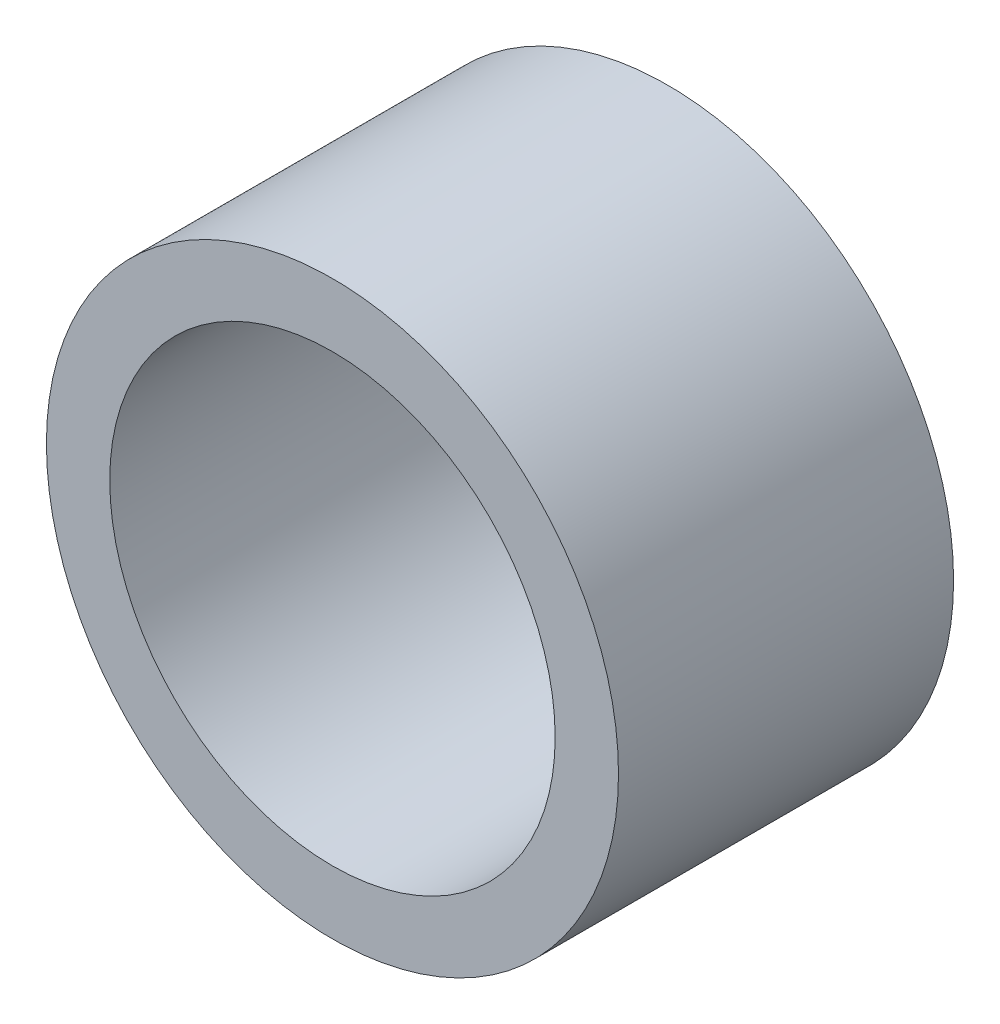
ISO-10303-21;
HEADER;
FILE_DESCRIPTION(('STEP AP214'),'2;1');
FILE_NAME('part.step','',(''),(''),'','','');
FILE_SCHEMA(('AUTOMOTIVE_DESIGN { 1 0 10303 214 1 1 1 1 }'));
ENDSEC;
DATA;
#1=APPLICATION_CONTEXT('core data for automotive mechanical design processes');
#2=APPLICATION_PROTOCOL_DEFINITION('international standard','automotive_design',2000,#1);
#3=PRODUCT_CONTEXT('',#1,'mechanical');
#4=PRODUCT('Part','Part','',(#3));
#5=PRODUCT_RELATED_PRODUCT_CATEGORY('part','',(#4));
#6=PRODUCT_DEFINITION_FORMATION('','',#4);
#7=PRODUCT_DEFINITION_CONTEXT('part definition',#1,'design');
#8=PRODUCT_DEFINITION('design','',#6,#7);
#9=PRODUCT_DEFINITION_SHAPE('','',#8);
#10=(LENGTH_UNIT() NAMED_UNIT(*) SI_UNIT(.MILLI.,.METRE.));
#11=(NAMED_UNIT(*) PLANE_ANGLE_UNIT() SI_UNIT($,.RADIAN.));
#12=(NAMED_UNIT(*) SI_UNIT($,.STERADIAN.) SOLID_ANGLE_UNIT());
#13=UNCERTAINTY_MEASURE_WITH_UNIT(LENGTH_MEASURE(1.E-05),#10,'distance_accuracy_value','');
#14=(GEOMETRIC_REPRESENTATION_CONTEXT(3) GLOBAL_UNCERTAINTY_ASSIGNED_CONTEXT((#13)) GLOBAL_UNIT_ASSIGNED_CONTEXT((#10,
#11,#12)) REPRESENTATION_CONTEXT('',''));
#15=CARTESIAN_POINT('',(0.,0.,0.));
#16=DIRECTION('',(0.,0.,1.));
#17=DIRECTION('',(1.,0.,0.));
#18=AXIS2_PLACEMENT_3D('',#15,#16,#17);
#19=CARTESIAN_POINT('',(0.,0.,4.1));
#20=DIRECTION('',(0.,0.,1.));
#21=DIRECTION('',(1.,0.,0.));
#22=AXIS2_PLACEMENT_3D('',#19,#20,#21);
#23=PLANE('',#22);
#24=CARTESIAN_POINT('',(0.,0.,4.1));
#25=DIRECTION('',(0.,0.,1.));
#26=DIRECTION('',(1.,0.,0.));
#27=AXIS2_PLACEMENT_3D('',#24,#25,#26);
#28=CIRCLE('',#27,3.5);
#29=CARTESIAN_POINT('',(3.5,0.,4.1));
#30=VERTEX_POINT('',#29);
#31=EDGE_CURVE('E10',#30,#30,#28,.T.);
#32=ORIENTED_EDGE('',*,*,#31,.T.);
#33=EDGE_LOOP('',(#32));
#34=FACE_BOUND('',#33,.T.);
#35=CARTESIAN_POINT('',(0.,0.,4.1));
#36=DIRECTION('',(0.,0.,1.));
#37=DIRECTION('',(1.,0.,0.));
#38=AXIS2_PLACEMENT_3D('',#35,#36,#37);
#39=CIRCLE('',#38,2.725);
#40=CARTESIAN_POINT('',(2.725,0.,4.1));
#41=VERTEX_POINT('',#40);
#42=EDGE_CURVE('E42',#41,#41,#39,.T.);
#43=ORIENTED_EDGE('',*,*,#42,.F.);
#44=EDGE_LOOP('',(#43));
#45=FACE_BOUND('',#44,.T.);
#46=ADVANCED_FACE('F31',(#34,#45),#23,.T.);
#47=CARTESIAN_POINT('',(0.,0.,0.));
#48=DIRECTION('',(0.,0.,1.));
#49=DIRECTION('',(1.,0.,0.));
#50=AXIS2_PLACEMENT_3D('',#47,#48,#49);
#51=PLANE('',#50);
#52=CARTESIAN_POINT('',(0.,0.,0.));
#53=DIRECTION('',(0.,0.,1.));
#54=DIRECTION('',(1.,0.,0.));
#55=AXIS2_PLACEMENT_3D('',#52,#53,#54);
#56=CIRCLE('',#55,3.5);
#57=CARTESIAN_POINT('',(3.5,0.,0.));
#58=VERTEX_POINT('',#57);
#59=EDGE_CURVE('E35',#58,#58,#56,.T.);
#60=ORIENTED_EDGE('',*,*,#59,.F.);
#61=EDGE_LOOP('',(#60));
#62=FACE_BOUND('',#61,.T.);
#63=CARTESIAN_POINT('',(0.,0.,0.));
#64=DIRECTION('',(0.,0.,1.));
#65=DIRECTION('',(1.,0.,0.));
#66=AXIS2_PLACEMENT_3D('',#63,#64,#65);
#67=CIRCLE('',#66,2.725);
#68=CARTESIAN_POINT('',(2.725,0.,0.));
#69=VERTEX_POINT('',#68);
#70=EDGE_CURVE('E44',#69,#69,#67,.T.);
#71=ORIENTED_EDGE('',*,*,#70,.T.);
#72=EDGE_LOOP('',(#71));
#73=FACE_BOUND('',#72,.T.);
#74=ADVANCED_FACE('F54',(#62,#73),#51,.F.);
#75=CARTESIAN_POINT('',(0.,0.,4.1));
#76=DIRECTION('',(0.,0.,-1.));
#77=DIRECTION('',(-1.,0.,0.));
#78=AXIS2_PLACEMENT_3D('',#75,#76,#77);
#79=CYLINDRICAL_SURFACE('',#78,3.5);
#80=ORIENTED_EDGE('',*,*,#31,.F.);
#81=EDGE_LOOP('',(#80));
#82=FACE_BOUND('',#81,.T.);
#83=ORIENTED_EDGE('',*,*,#59,.T.);
#84=EDGE_LOOP('',(#83));
#85=FACE_BOUND('',#84,.T.);
#86=ADVANCED_FACE('F33',(#82,#85),#79,.T.);
#87=CARTESIAN_POINT('',(0.,0.,4.1));
#88=DIRECTION('',(0.,0.,-1.));
#89=DIRECTION('',(-1.,0.,0.));
#90=AXIS2_PLACEMENT_3D('',#87,#88,#89);
#91=CYLINDRICAL_SURFACE('',#90,2.725);
#92=ORIENTED_EDGE('',*,*,#42,.T.);
#93=EDGE_LOOP('',(#92));
#94=FACE_BOUND('',#93,.T.);
#95=ORIENTED_EDGE('',*,*,#70,.F.);
#96=EDGE_LOOP('',(#95));
#97=FACE_BOUND('',#96,.T.);
#98=ADVANCED_FACE('F50',(#94,#97),#91,.F.);
#99=CLOSED_SHELL('',(#46,#74,#86,#98));
#100=MANIFOLD_SOLID_BREP('B2',#99);
#101=ADVANCED_BREP_SHAPE_REPRESENTATION('',(#18,#100),#14);
#102=SHAPE_DEFINITION_REPRESENTATION(#9,#101);
ENDSEC;
END-ISO-10303-21;
